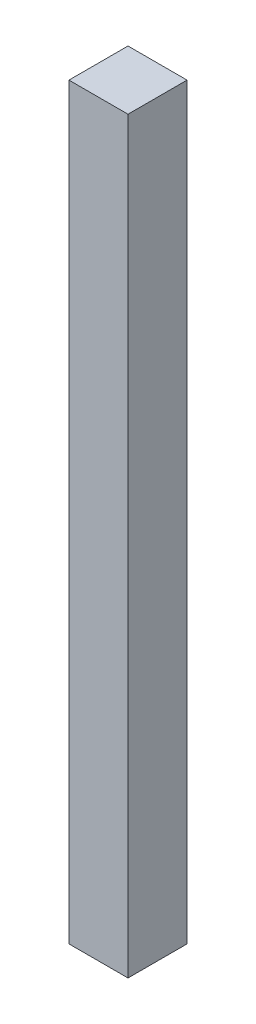
ISO-10303-21;
HEADER;
FILE_DESCRIPTION(('STEP AP214'),'2;1');
FILE_NAME('part.step','',(''),(''),'','','');
FILE_SCHEMA(('AUTOMOTIVE_DESIGN { 1 0 10303 214 1 1 1 1 }'));
ENDSEC;
DATA;
#1=APPLICATION_CONTEXT('core data for automotive mechanical design processes');
#2=APPLICATION_PROTOCOL_DEFINITION('international standard','automotive_design',2000,#1);
#3=PRODUCT_CONTEXT('',#1,'mechanical');
#4=PRODUCT('Part','Part','',(#3));
#5=PRODUCT_RELATED_PRODUCT_CATEGORY('part','',(#4));
#6=PRODUCT_DEFINITION_FORMATION('','',#4);
#7=PRODUCT_DEFINITION_CONTEXT('part definition',#1,'design');
#8=PRODUCT_DEFINITION('design','',#6,#7);
#9=PRODUCT_DEFINITION_SHAPE('','',#8);
#10=(LENGTH_UNIT() NAMED_UNIT(*) SI_UNIT(.MILLI.,.METRE.));
#11=(NAMED_UNIT(*) PLANE_ANGLE_UNIT() SI_UNIT($,.RADIAN.));
#12=(NAMED_UNIT(*) SI_UNIT($,.STERADIAN.) SOLID_ANGLE_UNIT());
#13=UNCERTAINTY_MEASURE_WITH_UNIT(LENGTH_MEASURE(1.E-05),#10,'distance_accuracy_value','');
#14=(GEOMETRIC_REPRESENTATION_CONTEXT(3) GLOBAL_UNCERTAINTY_ASSIGNED_CONTEXT((#13)) GLOBAL_UNIT_ASSIGNED_CONTEXT((#10,
#11,#12)) REPRESENTATION_CONTEXT('',''));
#15=CARTESIAN_POINT('',(0.,0.,0.));
#16=DIRECTION('',(0.,0.,1.));
#17=DIRECTION('',(1.,0.,0.));
#18=AXIS2_PLACEMENT_3D('',#15,#16,#17);
#19=CARTESIAN_POINT('',(0.,190.,0.));
#20=DIRECTION('',(1.,0.,0.));
#21=DIRECTION('',(0.,0.,-1.));
#22=AXIS2_PLACEMENT_3D('',#19,#20,#21);
#23=PLANE('',#22);
#24=DIRECTION('',(0.,0.,1.));
#25=VECTOR('',#24,1.);
#26=CARTESIAN_POINT('',(0.,0.,0.));
#27=LINE('',#26,#25);
#28=CARTESIAN_POINT('',(0.,0.,-15.));
#29=VERTEX_POINT('',#28);
#30=CARTESIAN_POINT('',(0.,0.,0.));
#31=VERTEX_POINT('',#30);
#32=EDGE_CURVE('E102',#29,#31,#27,.T.);
#33=ORIENTED_EDGE('',*,*,#32,.T.);
#34=DIRECTION('',(0.,-1.,0.));
#35=VECTOR('',#34,1.);
#36=CARTESIAN_POINT('',(0.,190.,0.));
#37=LINE('',#36,#35);
#38=CARTESIAN_POINT('',(0.,190.,0.));
#39=VERTEX_POINT('',#38);
#40=EDGE_CURVE('E11',#39,#31,#37,.T.);
#41=ORIENTED_EDGE('',*,*,#40,.F.);
#42=DIRECTION('',(0.,0.,1.));
#43=VECTOR('',#42,1.);
#44=CARTESIAN_POINT('',(0.,190.,0.));
#45=LINE('',#44,#43);
#46=CARTESIAN_POINT('',(0.,190.,-15.));
#47=VERTEX_POINT('',#46);
#48=EDGE_CURVE('E90',#47,#39,#45,.T.);
#49=ORIENTED_EDGE('',*,*,#48,.F.);
#50=DIRECTION('',(0.,-1.,0.));
#51=VECTOR('',#50,1.);
#52=CARTESIAN_POINT('',(0.,190.,-15.));
#53=LINE('',#52,#51);
#54=EDGE_CURVE('E98',#47,#29,#53,.T.);
#55=ORIENTED_EDGE('',*,*,#54,.T.);
#56=EDGE_LOOP('',(#33,#41,#49,#55));
#57=FACE_BOUND('',#56,.T.);
#58=ADVANCED_FACE('F39',(#57),#23,.F.);
#59=CARTESIAN_POINT('',(0.,190.,0.));
#60=DIRECTION('',(0.,0.,-1.));
#61=DIRECTION('',(-1.,0.,0.));
#62=AXIS2_PLACEMENT_3D('',#59,#60,#61);
#63=PLANE('',#62);
#64=DIRECTION('',(1.,0.,0.));
#65=VECTOR('',#64,1.);
#66=CARTESIAN_POINT('',(0.,0.,0.));
#67=LINE('',#66,#65);
#68=CARTESIAN_POINT('',(15.,0.,0.));
#69=VERTEX_POINT('',#68);
#70=EDGE_CURVE('E94',#31,#69,#67,.T.);
#71=ORIENTED_EDGE('',*,*,#70,.T.);
#72=DIRECTION('',(0.,-1.,0.));
#73=VECTOR('',#72,1.);
#74=CARTESIAN_POINT('',(15.,190.,0.));
#75=LINE('',#74,#73);
#76=CARTESIAN_POINT('',(15.,190.,0.));
#77=VERTEX_POINT('',#76);
#78=EDGE_CURVE('E47',#77,#69,#75,.T.);
#79=ORIENTED_EDGE('',*,*,#78,.F.);
#80=DIRECTION('',(1.,0.,0.));
#81=VECTOR('',#80,1.);
#82=CARTESIAN_POINT('',(0.,190.,0.));
#83=LINE('',#82,#81);
#84=EDGE_CURVE('E85',#39,#77,#83,.T.);
#85=ORIENTED_EDGE('',*,*,#84,.F.);
#86=ORIENTED_EDGE('',*,*,#40,.T.);
#87=EDGE_LOOP('',(#71,#79,#85,#86));
#88=FACE_BOUND('',#87,.T.);
#89=ADVANCED_FACE('F93',(#88),#63,.F.);
#90=CARTESIAN_POINT('',(15.,190.,0.));
#91=DIRECTION('',(-1.,0.,0.));
#92=DIRECTION('',(0.,0.,1.));
#93=AXIS2_PLACEMENT_3D('',#90,#91,#92);
#94=PLANE('',#93);
#95=DIRECTION('',(0.,0.,-1.));
#96=VECTOR('',#95,1.);
#97=CARTESIAN_POINT('',(15.,0.,0.));
#98=LINE('',#97,#96);
#99=CARTESIAN_POINT('',(15.,0.,-15.));
#100=VERTEX_POINT('',#99);
#101=EDGE_CURVE('E72',#69,#100,#98,.T.);
#102=ORIENTED_EDGE('',*,*,#101,.T.);
#103=DIRECTION('',(0.,-1.,0.));
#104=VECTOR('',#103,1.);
#105=CARTESIAN_POINT('',(15.,190.,-15.));
#106=LINE('',#105,#104);
#107=CARTESIAN_POINT('',(15.,190.,-15.));
#108=VERTEX_POINT('',#107);
#109=EDGE_CURVE('E95',#108,#100,#106,.T.);
#110=ORIENTED_EDGE('',*,*,#109,.F.);
#111=DIRECTION('',(0.,0.,-1.));
#112=VECTOR('',#111,1.);
#113=CARTESIAN_POINT('',(15.,190.,0.));
#114=LINE('',#113,#112);
#115=EDGE_CURVE('E88',#77,#108,#114,.T.);
#116=ORIENTED_EDGE('',*,*,#115,.F.);
#117=ORIENTED_EDGE('',*,*,#78,.T.);
#118=EDGE_LOOP('',(#102,#110,#116,#117));
#119=FACE_BOUND('',#118,.T.);
#120=ADVANCED_FACE('F96',(#119),#94,.F.);
#121=CARTESIAN_POINT('',(0.,190.,-15.));
#122=DIRECTION('',(0.,0.,1.));
#123=DIRECTION('',(1.,0.,0.));
#124=AXIS2_PLACEMENT_3D('',#121,#122,#123);
#125=PLANE('',#124);
#126=DIRECTION('',(-1.,0.,0.));
#127=VECTOR('',#126,1.);
#128=CARTESIAN_POINT('',(0.,0.,-15.));
#129=LINE('',#128,#127);
#130=EDGE_CURVE('E78',#100,#29,#129,.T.);
#131=ORIENTED_EDGE('',*,*,#130,.T.);
#132=ORIENTED_EDGE('',*,*,#54,.F.);
#133=DIRECTION('',(-1.,0.,0.));
#134=VECTOR('',#133,1.);
#135=CARTESIAN_POINT('',(0.,190.,-15.));
#136=LINE('',#135,#134);
#137=EDGE_CURVE('E55',#108,#47,#136,.T.);
#138=ORIENTED_EDGE('',*,*,#137,.F.);
#139=ORIENTED_EDGE('',*,*,#109,.T.);
#140=EDGE_LOOP('',(#131,#132,#138,#139));
#141=FACE_BOUND('',#140,.T.);
#142=ADVANCED_FACE('F109',(#141),#125,.F.);
#143=CARTESIAN_POINT('',(0.,190.,0.));
#144=DIRECTION('',(0.,-1.,0.));
#145=DIRECTION('',(0.,0.,-1.));
#146=AXIS2_PLACEMENT_3D('',#143,#144,#145);
#147=PLANE('',#146);
#148=ORIENTED_EDGE('',*,*,#48,.T.);
#149=ORIENTED_EDGE('',*,*,#84,.T.);
#150=ORIENTED_EDGE('',*,*,#115,.T.);
#151=ORIENTED_EDGE('',*,*,#137,.T.);
#152=EDGE_LOOP('',(#148,#149,#150,#151));
#153=FACE_BOUND('',#152,.T.);
#154=ADVANCED_FACE('F86',(#153),#147,.F.);
#155=CARTESIAN_POINT('',(0.,0.,0.));
#156=DIRECTION('',(0.,-1.,0.));
#157=DIRECTION('',(0.,0.,-1.));
#158=AXIS2_PLACEMENT_3D('',#155,#156,#157);
#159=PLANE('',#158);
#160=ORIENTED_EDGE('',*,*,#32,.F.);
#161=ORIENTED_EDGE('',*,*,#130,.F.);
#162=ORIENTED_EDGE('',*,*,#101,.F.);
#163=ORIENTED_EDGE('',*,*,#70,.F.);
#164=EDGE_LOOP('',(#160,#161,#162,#163));
#165=FACE_BOUND('',#164,.T.);
#166=ADVANCED_FACE('F112',(#165),#159,.T.);
#167=CLOSED_SHELL('',(#58,#89,#120,#142,#154,#166));
#168=MANIFOLD_SOLID_BREP('B2',#167);
#169=ADVANCED_BREP_SHAPE_REPRESENTATION('',(#18,#168),#14);
#170=SHAPE_DEFINITION_REPRESENTATION(#9,#169);
ENDSEC;
END-ISO-10303-21;
